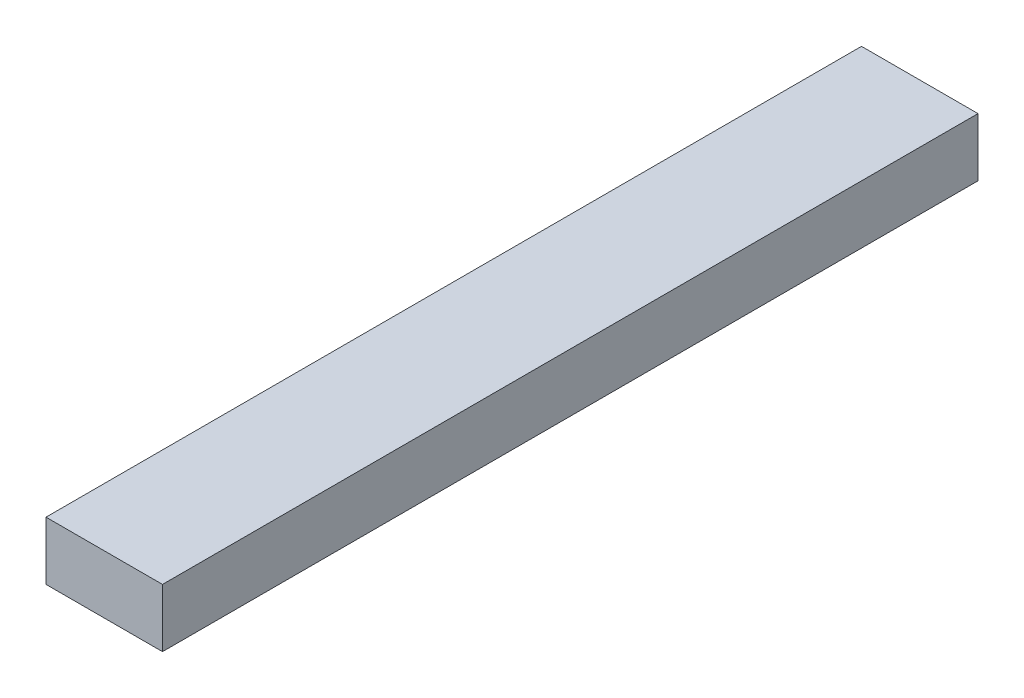
ISO-10303-21;
HEADER;
FILE_DESCRIPTION(('STEP AP214'),'2;1');
FILE_NAME('part.step','',(''),(''),'','','');
FILE_SCHEMA(('AUTOMOTIVE_DESIGN { 1 0 10303 214 1 1 1 1 }'));
ENDSEC;
DATA;
#1=APPLICATION_CONTEXT('core data for automotive mechanical design processes');
#2=APPLICATION_PROTOCOL_DEFINITION('international standard','automotive_design',2000,#1);
#3=PRODUCT_CONTEXT('',#1,'mechanical');
#4=PRODUCT('Part','Part','',(#3));
#5=PRODUCT_RELATED_PRODUCT_CATEGORY('part','',(#4));
#6=PRODUCT_DEFINITION_FORMATION('','',#4);
#7=PRODUCT_DEFINITION_CONTEXT('part definition',#1,'design');
#8=PRODUCT_DEFINITION('design','',#6,#7);
#9=PRODUCT_DEFINITION_SHAPE('','',#8);
#10=(LENGTH_UNIT() NAMED_UNIT(*) SI_UNIT(.MILLI.,.METRE.));
#11=(NAMED_UNIT(*) PLANE_ANGLE_UNIT() SI_UNIT($,.RADIAN.));
#12=(NAMED_UNIT(*) SI_UNIT($,.STERADIAN.) SOLID_ANGLE_UNIT());
#13=UNCERTAINTY_MEASURE_WITH_UNIT(LENGTH_MEASURE(1.E-05),#10,'distance_accuracy_value','');
#14=(GEOMETRIC_REPRESENTATION_CONTEXT(3) GLOBAL_UNCERTAINTY_ASSIGNED_CONTEXT((#13)) GLOBAL_UNIT_ASSIGNED_CONTEXT((#10,
#11,#12)) REPRESENTATION_CONTEXT('',''));
#15=CARTESIAN_POINT('',(0.,0.,0.));
#16=DIRECTION('',(0.,0.,1.));
#17=DIRECTION('',(1.,0.,0.));
#18=AXIS2_PLACEMENT_3D('',#15,#16,#17);
#19=CARTESIAN_POINT('',(-30.203066439523,10.990800681431,355.6));
#20=DIRECTION('',(1.,0.,0.));
#21=DIRECTION('',(0.,1.,0.));
#22=AXIS2_PLACEMENT_3D('',#19,#20,#21);
#23=PLANE('',#22);
#24=DIRECTION('',(0.,-1.,0.));
#25=VECTOR('',#24,1.);
#26=CARTESIAN_POINT('',(-30.203066439523,10.990800681431,0.));
#27=LINE('',#26,#25);
#28=CARTESIAN_POINT('',(-30.203066439523,10.990800681431,0.));
#29=VERTEX_POINT('',#28);
#30=CARTESIAN_POINT('',(-30.203066439523,-14.409199318569,0.));
#31=VERTEX_POINT('',#30);
#32=EDGE_CURVE('E96',#29,#31,#27,.T.);
#33=ORIENTED_EDGE('',*,*,#32,.T.);
#34=DIRECTION('',(0.,0.,-1.));
#35=VECTOR('',#34,1.);
#36=CARTESIAN_POINT('',(-30.203066439523,-14.409199318569,355.6));
#37=LINE('',#36,#35);
#38=CARTESIAN_POINT('',(-30.203066439523,-14.409199318569,355.6));
#39=VERTEX_POINT('',#38);
#40=EDGE_CURVE('E11',#39,#31,#37,.T.);
#41=ORIENTED_EDGE('',*,*,#40,.F.);
#42=DIRECTION('',(0.,-1.,0.));
#43=VECTOR('',#42,1.);
#44=CARTESIAN_POINT('',(-30.203066439523,10.990800681431,355.6));
#45=LINE('',#44,#43);
#46=CARTESIAN_POINT('',(-30.203066439523,10.990800681431,355.6));
#47=VERTEX_POINT('',#46);
#48=EDGE_CURVE('E84',#47,#39,#45,.T.);
#49=ORIENTED_EDGE('',*,*,#48,.F.);
#50=DIRECTION('',(0.,0.,-1.));
#51=VECTOR('',#50,1.);
#52=CARTESIAN_POINT('',(-30.203066439523,10.990800681431,355.6));
#53=LINE('',#52,#51);
#54=EDGE_CURVE('E92',#47,#29,#53,.T.);
#55=ORIENTED_EDGE('',*,*,#54,.T.);
#56=EDGE_LOOP('',(#33,#41,#49,#55));
#57=FACE_BOUND('',#56,.T.);
#58=ADVANCED_FACE('F33',(#57),#23,.F.);
#59=CARTESIAN_POINT('',(-30.203066439523,-14.409199318569,355.6));
#60=DIRECTION('',(0.,1.,0.));
#61=DIRECTION('',(0.,0.,1.));
#62=AXIS2_PLACEMENT_3D('',#59,#60,#61);
#63=PLANE('',#62);
#64=DIRECTION('',(1.,0.,0.));
#65=VECTOR('',#64,1.);
#66=CARTESIAN_POINT('',(-30.203066439523,-14.409199318569,0.));
#67=LINE('',#66,#65);
#68=CARTESIAN_POINT('',(20.596933560477,-14.409199318569,0.));
#69=VERTEX_POINT('',#68);
#70=EDGE_CURVE('E88',#31,#69,#67,.T.);
#71=ORIENTED_EDGE('',*,*,#70,.T.);
#72=DIRECTION('',(0.,0.,-1.));
#73=VECTOR('',#72,1.);
#74=CARTESIAN_POINT('',(20.596933560477,-14.409199318569,355.6));
#75=LINE('',#74,#73);
#76=CARTESIAN_POINT('',(20.596933560477,-14.409199318569,355.6));
#77=VERTEX_POINT('',#76);
#78=EDGE_CURVE('E41',#77,#69,#75,.T.);
#79=ORIENTED_EDGE('',*,*,#78,.F.);
#80=DIRECTION('',(1.,0.,0.));
#81=VECTOR('',#80,1.);
#82=CARTESIAN_POINT('',(-30.203066439523,-14.409199318569,355.6));
#83=LINE('',#82,#81);
#84=EDGE_CURVE('E79',#39,#77,#83,.T.);
#85=ORIENTED_EDGE('',*,*,#84,.F.);
#86=ORIENTED_EDGE('',*,*,#40,.T.);
#87=EDGE_LOOP('',(#71,#79,#85,#86));
#88=FACE_BOUND('',#87,.T.);
#89=ADVANCED_FACE('F87',(#88),#63,.F.);
#90=CARTESIAN_POINT('',(20.596933560477,10.990800681431,355.6));
#91=DIRECTION('',(-1.,0.,0.));
#92=DIRECTION('',(0.,0.,1.));
#93=AXIS2_PLACEMENT_3D('',#90,#91,#92);
#94=PLANE('',#93);
#95=DIRECTION('',(0.,1.,0.));
#96=VECTOR('',#95,1.);
#97=CARTESIAN_POINT('',(20.596933560477,10.990800681431,0.));
#98=LINE('',#97,#96);
#99=CARTESIAN_POINT('',(20.596933560477,10.990800681431,0.));
#100=VERTEX_POINT('',#99);
#101=EDGE_CURVE('E66',#69,#100,#98,.T.);
#102=ORIENTED_EDGE('',*,*,#101,.T.);
#103=DIRECTION('',(0.,0.,-1.));
#104=VECTOR('',#103,1.);
#105=CARTESIAN_POINT('',(20.596933560477,10.990800681431,355.6));
#106=LINE('',#105,#104);
#107=CARTESIAN_POINT('',(20.596933560477,10.990800681431,355.6));
#108=VERTEX_POINT('',#107);
#109=EDGE_CURVE('E89',#108,#100,#106,.T.);
#110=ORIENTED_EDGE('',*,*,#109,.F.);
#111=DIRECTION('',(0.,1.,0.));
#112=VECTOR('',#111,1.);
#113=CARTESIAN_POINT('',(20.596933560477,10.990800681431,355.6));
#114=LINE('',#113,#112);
#115=EDGE_CURVE('E82',#77,#108,#114,.T.);
#116=ORIENTED_EDGE('',*,*,#115,.F.);
#117=ORIENTED_EDGE('',*,*,#78,.T.);
#118=EDGE_LOOP('',(#102,#110,#116,#117));
#119=FACE_BOUND('',#118,.T.);
#120=ADVANCED_FACE('F90',(#119),#94,.F.);
#121=CARTESIAN_POINT('',(-30.203066439523,10.990800681431,355.6));
#122=DIRECTION('',(0.,-1.,0.));
#123=DIRECTION('',(0.,0.,-1.));
#124=AXIS2_PLACEMENT_3D('',#121,#122,#123);
#125=PLANE('',#124);
#126=DIRECTION('',(-1.,0.,0.));
#127=VECTOR('',#126,1.);
#128=CARTESIAN_POINT('',(-30.203066439523,10.990800681431,0.));
#129=LINE('',#128,#127);
#130=EDGE_CURVE('E72',#100,#29,#129,.T.);
#131=ORIENTED_EDGE('',*,*,#130,.T.);
#132=ORIENTED_EDGE('',*,*,#54,.F.);
#133=DIRECTION('',(-1.,0.,0.));
#134=VECTOR('',#133,1.);
#135=CARTESIAN_POINT('',(-30.203066439523,10.990800681431,355.6));
#136=LINE('',#135,#134);
#137=EDGE_CURVE('E49',#108,#47,#136,.T.);
#138=ORIENTED_EDGE('',*,*,#137,.F.);
#139=ORIENTED_EDGE('',*,*,#109,.T.);
#140=EDGE_LOOP('',(#131,#132,#138,#139));
#141=FACE_BOUND('',#140,.T.);
#142=ADVANCED_FACE('F103',(#141),#125,.F.);
#143=CARTESIAN_POINT('',(0.,0.,355.6));
#144=DIRECTION('',(0.,0.,1.));
#145=DIRECTION('',(1.,0.,0.));
#146=AXIS2_PLACEMENT_3D('',#143,#144,#145);
#147=PLANE('',#146);
#148=ORIENTED_EDGE('',*,*,#48,.T.);
#149=ORIENTED_EDGE('',*,*,#84,.T.);
#150=ORIENTED_EDGE('',*,*,#115,.T.);
#151=ORIENTED_EDGE('',*,*,#137,.T.);
#152=EDGE_LOOP('',(#148,#149,#150,#151));
#153=FACE_BOUND('',#152,.T.);
#154=ADVANCED_FACE('F80',(#153),#147,.T.);
#155=CARTESIAN_POINT('',(0.,0.,0.));
#156=DIRECTION('',(0.,0.,1.));
#157=DIRECTION('',(1.,0.,0.));
#158=AXIS2_PLACEMENT_3D('',#155,#156,#157);
#159=PLANE('',#158);
#160=ORIENTED_EDGE('',*,*,#32,.F.);
#161=ORIENTED_EDGE('',*,*,#130,.F.);
#162=ORIENTED_EDGE('',*,*,#101,.F.);
#163=ORIENTED_EDGE('',*,*,#70,.F.);
#164=EDGE_LOOP('',(#160,#161,#162,#163));
#165=FACE_BOUND('',#164,.T.);
#166=ADVANCED_FACE('F106',(#165),#159,.F.);
#167=CLOSED_SHELL('',(#58,#89,#120,#142,#154,#166));
#168=MANIFOLD_SOLID_BREP('B2',#167);
#169=ADVANCED_BREP_SHAPE_REPRESENTATION('',(#18,#168),#14);
#170=SHAPE_DEFINITION_REPRESENTATION(#9,#169);
ENDSEC;
END-ISO-10303-21;
